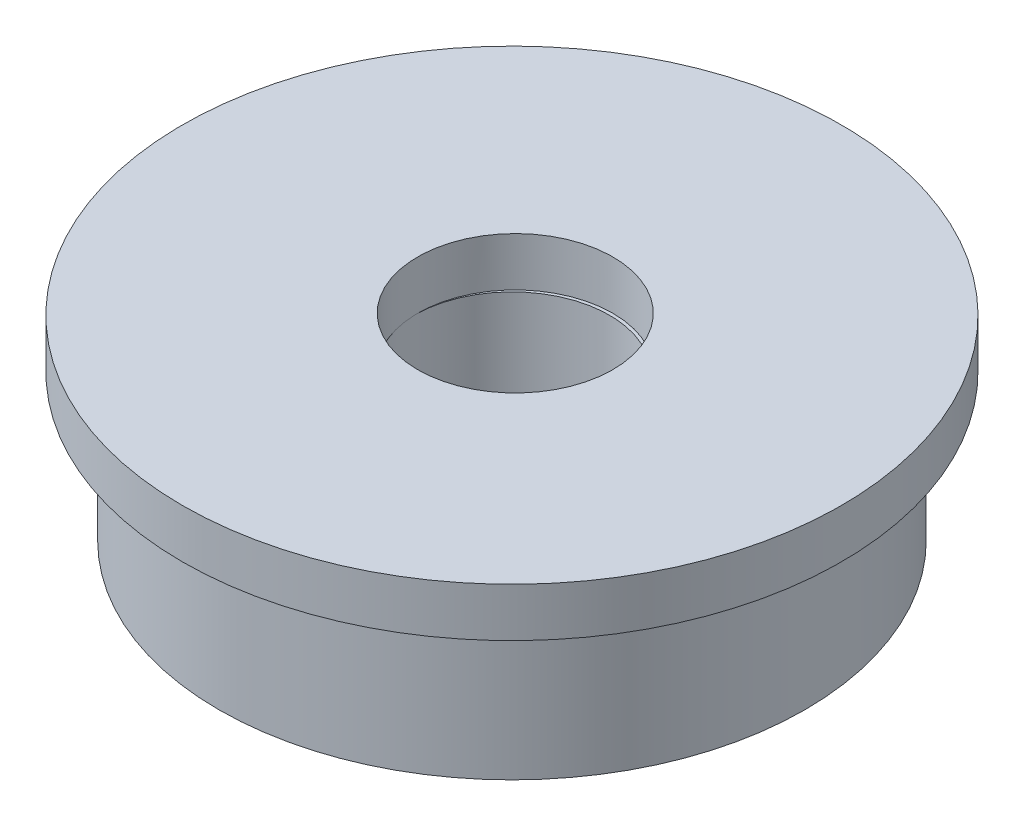
ISO-10303-21;
HEADER;
FILE_DESCRIPTION(('STEP AP214'),'2;1');
FILE_NAME('part.step','',(''),(''),'','','');
FILE_SCHEMA(('AUTOMOTIVE_DESIGN { 1 0 10303 214 1 1 1 1 }'));
ENDSEC;
DATA;
#1=APPLICATION_CONTEXT('core data for automotive mechanical design processes');
#2=APPLICATION_PROTOCOL_DEFINITION('international standard','automotive_design',2000,#1);
#3=PRODUCT_CONTEXT('',#1,'mechanical');
#4=PRODUCT('Part','Part','',(#3));
#5=PRODUCT_RELATED_PRODUCT_CATEGORY('part','',(#4));
#6=PRODUCT_DEFINITION_FORMATION('','',#4);
#7=PRODUCT_DEFINITION_CONTEXT('part definition',#1,'design');
#8=PRODUCT_DEFINITION('design','',#6,#7);
#9=PRODUCT_DEFINITION_SHAPE('','',#8);
#10=(LENGTH_UNIT() NAMED_UNIT(*) SI_UNIT(.MILLI.,.METRE.));
#11=(NAMED_UNIT(*) PLANE_ANGLE_UNIT() SI_UNIT($,.RADIAN.));
#12=(NAMED_UNIT(*) SI_UNIT($,.STERADIAN.) SOLID_ANGLE_UNIT());
#13=UNCERTAINTY_MEASURE_WITH_UNIT(LENGTH_MEASURE(1.E-05),#10,'distance_accuracy_value','');
#14=(GEOMETRIC_REPRESENTATION_CONTEXT(3) GLOBAL_UNCERTAINTY_ASSIGNED_CONTEXT((#13)) GLOBAL_UNIT_ASSIGNED_CONTEXT((#10,
#11,#12)) REPRESENTATION_CONTEXT('',''));
#15=CARTESIAN_POINT('',(0.,0.,0.));
#16=DIRECTION('',(0.,0.,1.));
#17=DIRECTION('',(1.,0.,0.));
#18=AXIS2_PLACEMENT_3D('',#15,#16,#17);
#19=CARTESIAN_POINT('',(0.,3.,0.));
#20=DIRECTION('',(0.,1.,0.));
#21=DIRECTION('',(0.,0.,1.));
#22=AXIS2_PLACEMENT_3D('',#19,#20,#21);
#23=PLANE('',#22);
#24=CARTESIAN_POINT('',(0.,3.,0.));
#25=DIRECTION('',(0.,1.,0.));
#26=DIRECTION('',(0.,0.,1.));
#27=AXIS2_PLACEMENT_3D('',#24,#25,#26);
#28=CIRCLE('',#27,2.);
#29=CARTESIAN_POINT('',(1.99971257524608,3.,-0.0339059936103875));
#30=VERTEX_POINT('',#29);
#31=CARTESIAN_POINT('',(-1.99971257524608,3.,-0.0339059936103875));
#32=VERTEX_POINT('',#31);
#33=EDGE_CURVE('E66',#30,#32,#28,.T.);
#34=ORIENTED_EDGE('',*,*,#33,.F.);
#35=CARTESIAN_POINT('',(0.,3.,-0.0678119872207749));
#36=DIRECTION('',(0.,1.,0.));
#37=DIRECTION('',(0.,0.,1.));
#38=AXIS2_PLACEMENT_3D('',#35,#36,#37);
#39=CIRCLE('',#38,2.);
#40=EDGE_CURVE('E56',#30,#32,#39,.T.);
#41=ORIENTED_EDGE('',*,*,#40,.T.);
#42=EDGE_LOOP('',(#34,#41));
#43=FACE_BOUND('',#42,.T.);
#44=ADVANCED_FACE('F35',(#43),#23,.T.);
#45=CARTESIAN_POINT('',(0.,0.,0.));
#46=DIRECTION('',(0.,1.,0.));
#47=DIRECTION('',(0.,0.,1.));
#48=AXIS2_PLACEMENT_3D('',#45,#46,#47);
#49=PLANE('',#48);
#50=CARTESIAN_POINT('',(0.,0.,0.));
#51=DIRECTION('',(0.,1.,0.));
#52=DIRECTION('',(0.,0.,1.));
#53=AXIS2_PLACEMENT_3D('',#50,#51,#52);
#54=CIRCLE('',#53,6.);
#55=CARTESIAN_POINT('',(0.,0.,6.));
#56=VERTEX_POINT('',#55);
#57=EDGE_CURVE('E39',#56,#56,#54,.T.);
#58=ORIENTED_EDGE('',*,*,#57,.F.);
#59=EDGE_LOOP('',(#58));
#60=FACE_BOUND('',#59,.T.);
#61=CARTESIAN_POINT('',(0.,0.,0.));
#62=DIRECTION('',(0.,1.,0.));
#63=DIRECTION('',(0.,0.,1.));
#64=AXIS2_PLACEMENT_3D('',#61,#62,#63);
#65=CIRCLE('',#64,2.);
#66=CARTESIAN_POINT('',(0.,0.,2.));
#67=VERTEX_POINT('',#66);
#68=EDGE_CURVE('E67',#67,#67,#65,.T.);
#69=ORIENTED_EDGE('',*,*,#68,.T.);
#70=EDGE_LOOP('',(#69));
#71=FACE_BOUND('',#70,.T.);
#72=ADVANCED_FACE('F100',(#60,#71),#49,.F.);
#73=CARTESIAN_POINT('',(0.,3.,0.));
#74=DIRECTION('',(0.,-1.,0.));
#75=DIRECTION('',(0.,0.,-1.));
#76=AXIS2_PLACEMENT_3D('',#73,#74,#75);
#77=CYLINDRICAL_SURFACE('',#76,6.);
#78=CARTESIAN_POINT('',(0.,3.,0.));
#79=DIRECTION('',(0.,1.,0.));
#80=DIRECTION('',(0.,0.,1.));
#81=AXIS2_PLACEMENT_3D('',#78,#79,#80);
#82=CIRCLE('',#81,6.);
#83=CARTESIAN_POINT('',(0.,3.,6.));
#84=VERTEX_POINT('',#83);
#85=EDGE_CURVE('E11',#84,#84,#82,.T.);
#86=ORIENTED_EDGE('',*,*,#85,.F.);
#87=EDGE_LOOP('',(#86));
#88=FACE_BOUND('',#87,.T.);
#89=ORIENTED_EDGE('',*,*,#57,.T.);
#90=EDGE_LOOP('',(#89));
#91=FACE_BOUND('',#90,.T.);
#92=ADVANCED_FACE('F37',(#88,#91),#77,.T.);
#93=CARTESIAN_POINT('',(0.,3.,0.));
#94=DIRECTION('',(0.,-1.,0.));
#95=DIRECTION('',(0.,0.,-1.));
#96=AXIS2_PLACEMENT_3D('',#93,#94,#95);
#97=CYLINDRICAL_SURFACE('',#96,2.);
#98=ORIENTED_EDGE('',*,*,#33,.T.);
#99=EDGE_CURVE('E54',#32,#30,#28,.T.);
#100=ORIENTED_EDGE('',*,*,#99,.T.);
#101=EDGE_LOOP('',(#98,#100));
#102=FACE_BOUND('',#101,.T.);
#103=ORIENTED_EDGE('',*,*,#68,.F.);
#104=EDGE_LOOP('',(#103));
#105=FACE_BOUND('',#104,.T.);
#106=ADVANCED_FACE('F64',(#102,#105),#97,.F.);
#107=CARTESIAN_POINT('',(0.,3.,0.));
#108=DIRECTION('',(0.,1.,0.));
#109=DIRECTION('',(0.,0.,1.));
#110=AXIS2_PLACEMENT_3D('',#107,#108,#109);
#111=PLANE('',#110);
#112=CARTESIAN_POINT('',(0.,3.,0.));
#113=DIRECTION('',(0.,1.,0.));
#114=DIRECTION('',(0.,0.,1.));
#115=AXIS2_PLACEMENT_3D('',#112,#113,#114);
#116=CIRCLE('',#115,6.75);
#117=CARTESIAN_POINT('',(0.,3.,6.75));
#118=VERTEX_POINT('',#117);
#119=EDGE_CURVE('E72',#118,#118,#116,.T.);
#120=ORIENTED_EDGE('',*,*,#119,.F.);
#121=EDGE_LOOP('',(#120));
#122=FACE_BOUND('',#121,.T.);
#123=ORIENTED_EDGE('',*,*,#85,.T.);
#124=EDGE_LOOP('',(#123));
#125=FACE_BOUND('',#124,.T.);
#126=ADVANCED_FACE('F89',(#122,#125),#111,.F.);
#127=CARTESIAN_POINT('',(0.,4.,0.));
#128=DIRECTION('',(0.,1.,0.));
#129=DIRECTION('',(0.,0.,1.));
#130=AXIS2_PLACEMENT_3D('',#127,#128,#129);
#131=PLANE('',#130);
#132=CARTESIAN_POINT('',(0.,4.,0.));
#133=DIRECTION('',(0.,1.,0.));
#134=DIRECTION('',(0.,0.,1.));
#135=AXIS2_PLACEMENT_3D('',#132,#133,#134);
#136=CIRCLE('',#135,6.75);
#137=CARTESIAN_POINT('',(0.,4.,6.75));
#138=VERTEX_POINT('',#137);
#139=EDGE_CURVE('E75',#138,#138,#136,.T.);
#140=ORIENTED_EDGE('',*,*,#139,.T.);
#141=EDGE_LOOP('',(#140));
#142=FACE_BOUND('',#141,.T.);
#143=CARTESIAN_POINT('',(0.,4.,-0.0678119872207749));
#144=DIRECTION('',(0.,1.,0.));
#145=DIRECTION('',(0.,0.,1.));
#146=AXIS2_PLACEMENT_3D('',#143,#144,#145);
#147=CIRCLE('',#146,2.);
#148=CARTESIAN_POINT('',(0.,4.,1.93218801277923));
#149=VERTEX_POINT('',#148);
#150=EDGE_CURVE('E62',#149,#149,#147,.T.);
#151=ORIENTED_EDGE('',*,*,#150,.F.);
#152=EDGE_LOOP('',(#151));
#153=FACE_BOUND('',#152,.T.);
#154=ADVANCED_FACE('F87',(#142,#153),#131,.T.);
#155=ORIENTED_EDGE('',*,*,#99,.F.);
#156=EDGE_CURVE('E49',#32,#30,#39,.T.);
#157=ORIENTED_EDGE('',*,*,#156,.T.);
#158=EDGE_LOOP('',(#155,#157));
#159=FACE_BOUND('',#158,.T.);
#160=ADVANCED_FACE('F52',(#159),#111,.F.);
#161=CARTESIAN_POINT('',(0.,4.,0.));
#162=DIRECTION('',(0.,-1.,0.));
#163=DIRECTION('',(0.,0.,-1.));
#164=AXIS2_PLACEMENT_3D('',#161,#162,#163);
#165=CYLINDRICAL_SURFACE('',#164,6.75);
#166=ORIENTED_EDGE('',*,*,#139,.F.);
#167=EDGE_LOOP('',(#166));
#168=FACE_BOUND('',#167,.T.);
#169=ORIENTED_EDGE('',*,*,#119,.T.);
#170=EDGE_LOOP('',(#169));
#171=FACE_BOUND('',#170,.T.);
#172=ADVANCED_FACE('F95',(#168,#171),#165,.T.);
#173=CARTESIAN_POINT('',(0.,4.,-0.0678119872207749));
#174=DIRECTION('',(0.,-1.,0.));
#175=DIRECTION('',(0.,0.,-1.));
#176=AXIS2_PLACEMENT_3D('',#173,#174,#175);
#177=CYLINDRICAL_SURFACE('',#176,2.);
#178=ORIENTED_EDGE('',*,*,#150,.T.);
#179=EDGE_LOOP('',(#178));
#180=FACE_BOUND('',#179,.T.);
#181=ORIENTED_EDGE('',*,*,#40,.F.);
#182=ORIENTED_EDGE('',*,*,#156,.F.);
#183=EDGE_LOOP('',(#181,#182));
#184=FACE_BOUND('',#183,.T.);
#185=ADVANCED_FACE('F58',(#180,#184),#177,.F.);
#186=CLOSED_SHELL('',(#44,#72,#92,#106,#126,#154,#160,#172,#185));
#187=MANIFOLD_SOLID_BREP('B2',#186);
#188=ADVANCED_BREP_SHAPE_REPRESENTATION('',(#18,#187),#14);
#189=SHAPE_DEFINITION_REPRESENTATION(#9,#188);
ENDSEC;
END-ISO-10303-21;
